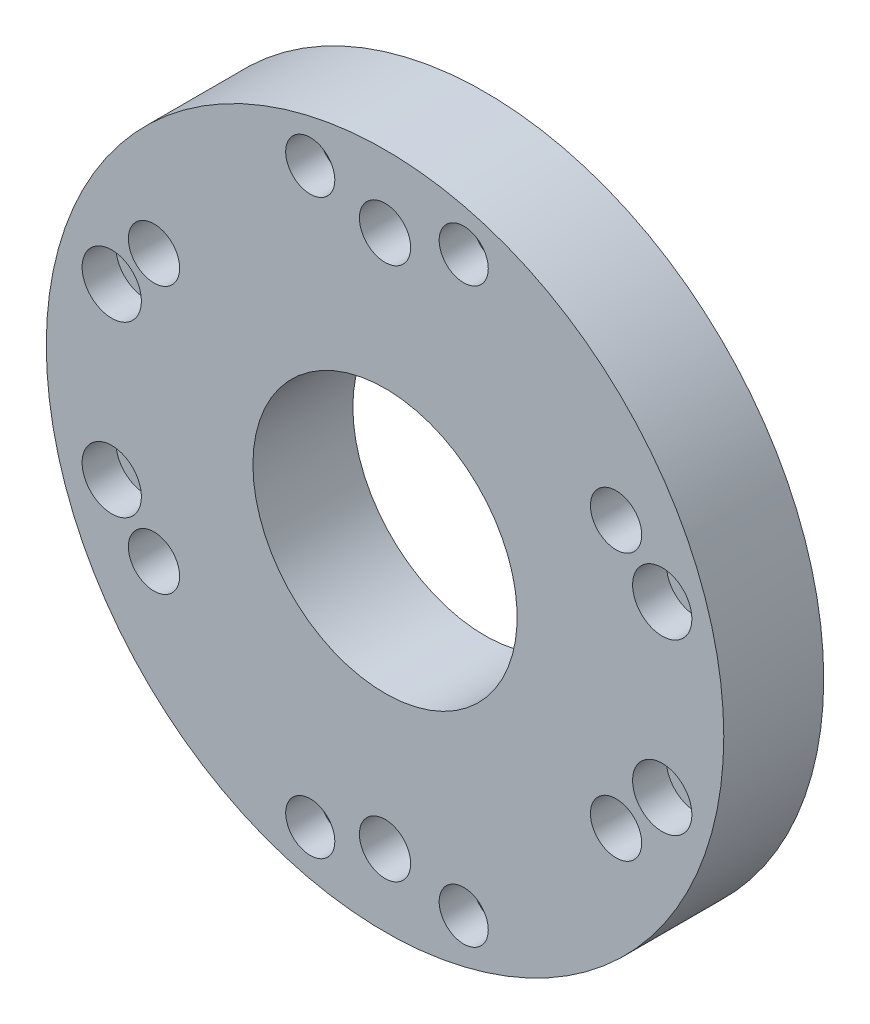
ISO-10303-21;
HEADER;
FILE_DESCRIPTION(('STEP AP214'),'2;1');
FILE_NAME('part.step','',(''),(''),'','','');
FILE_SCHEMA(('AUTOMOTIVE_DESIGN { 1 0 10303 214 1 1 1 1 }'));
ENDSEC;
DATA;
#1=APPLICATION_CONTEXT('core data for automotive mechanical design processes');
#2=APPLICATION_PROTOCOL_DEFINITION('international standard','automotive_design',2000,#1);
#3=PRODUCT_CONTEXT('',#1,'mechanical');
#4=PRODUCT('Part','Part','',(#3));
#5=PRODUCT_RELATED_PRODUCT_CATEGORY('part','',(#4));
#6=PRODUCT_DEFINITION_FORMATION('','',#4);
#7=PRODUCT_DEFINITION_CONTEXT('part definition',#1,'design');
#8=PRODUCT_DEFINITION('design','',#6,#7);
#9=PRODUCT_DEFINITION_SHAPE('','',#8);
#10=(LENGTH_UNIT() NAMED_UNIT(*) SI_UNIT(.MILLI.,.METRE.));
#11=(NAMED_UNIT(*) PLANE_ANGLE_UNIT() SI_UNIT($,.RADIAN.));
#12=(NAMED_UNIT(*) SI_UNIT($,.STERADIAN.) SOLID_ANGLE_UNIT());
#13=UNCERTAINTY_MEASURE_WITH_UNIT(LENGTH_MEASURE(1.E-05),#10,'distance_accuracy_value','');
#14=(GEOMETRIC_REPRESENTATION_CONTEXT(3) GLOBAL_UNCERTAINTY_ASSIGNED_CONTEXT((#13)) GLOBAL_UNIT_ASSIGNED_CONTEXT((#10,
#11,#12)) REPRESENTATION_CONTEXT('',''));
#15=CARTESIAN_POINT('',(0.,0.,0.));
#16=DIRECTION('',(0.,0.,1.));
#17=DIRECTION('',(1.,0.,0.));
#18=AXIS2_PLACEMENT_3D('',#15,#16,#17);
#19=CARTESIAN_POINT('',(32.7306438468949,10.1245664997554,11.8));
#20=DIRECTION('',(0.,0.,-1.));
#21=DIRECTION('',(-1.,0.,0.));
#22=AXIS2_PLACEMENT_3D('',#19,#20,#21);
#23=CYLINDRICAL_SURFACE('',#22,2.15);
#24=CARTESIAN_POINT('',(32.7306438468949,10.1245664997554,0.));
#25=DIRECTION('',(0.,0.,-1.));
#26=DIRECTION('',(-1.,0.,0.));
#27=AXIS2_PLACEMENT_3D('',#24,#25,#26);
#28=CIRCLE('',#27,2.15);
#29=CARTESIAN_POINT('',(30.5806438468949,10.1245664997554,0.));
#30=VERTEX_POINT('',#29);
#31=EDGE_CURVE('E50',#30,#30,#28,.T.);
#32=ORIENTED_EDGE('',*,*,#31,.T.);
#33=EDGE_LOOP('',(#32));
#34=FACE_BOUND('',#33,.T.);
#35=CARTESIAN_POINT('',(32.7306438468949,10.1245664997554,7.8));
#36=DIRECTION('',(0.,0.,1.));
#37=DIRECTION('',(1.,0.,0.));
#38=AXIS2_PLACEMENT_3D('',#35,#36,#37);
#39=CIRCLE('',#38,2.15);
#40=CARTESIAN_POINT('',(34.8806438468949,10.1245664997554,7.8));
#41=VERTEX_POINT('',#40);
#42=EDGE_CURVE('E41',#41,#41,#39,.F.);
#43=ORIENTED_EDGE('',*,*,#42,.F.);
#44=EDGE_LOOP('',(#43));
#45=FACE_BOUND('',#44,.T.);
#46=ADVANCED_FACE('F37',(#34,#45),#23,.F.);
#47=CARTESIAN_POINT('',(9.29064384689489,-33.6854335002446,11.8));
#48=DIRECTION('',(0.,0.,-1.));
#49=DIRECTION('',(-1.,0.,0.));
#50=AXIS2_PLACEMENT_3D('',#47,#48,#49);
#51=CYLINDRICAL_SURFACE('',#50,1.75);
#52=CARTESIAN_POINT('',(9.29064384689489,-33.6854335002446,0.));
#53=DIRECTION('',(0.,0.,-1.));
#54=DIRECTION('',(1.,0.,0.));
#55=AXIS2_PLACEMENT_3D('',#52,#53,#54);
#56=CIRCLE('',#55,1.75);
#57=CARTESIAN_POINT('',(11.0406438468949,-33.6854335002446,0.));
#58=VERTEX_POINT('',#57);
#59=EDGE_CURVE('E98',#58,#58,#56,.T.);
#60=ORIENTED_EDGE('',*,*,#59,.T.);
#61=EDGE_LOOP('',(#60));
#62=FACE_BOUND('',#61,.T.);
#63=CARTESIAN_POINT('',(9.29064384689489,-33.6854335002446,7.8));
#64=DIRECTION('',(0.,0.,1.));
#65=DIRECTION('',(1.,0.,0.));
#66=AXIS2_PLACEMENT_3D('',#63,#64,#65);
#67=CIRCLE('',#66,1.75);
#68=CARTESIAN_POINT('',(11.0406438468949,-33.6854335002446,7.8));
#69=VERTEX_POINT('',#68);
#70=EDGE_CURVE('E73',#69,#69,#67,.F.);
#71=ORIENTED_EDGE('',*,*,#70,.F.);
#72=EDGE_LOOP('',(#71));
#73=FACE_BOUND('',#72,.T.);
#74=ADVANCED_FACE('F146',(#62,#73),#51,.F.);
#75=CARTESIAN_POINT('',(-8.82935615310511,-33.6854335002446,11.8));
#76=DIRECTION('',(0.,0.,-1.));
#77=DIRECTION('',(-1.,0.,0.));
#78=AXIS2_PLACEMENT_3D('',#75,#76,#77);
#79=CYLINDRICAL_SURFACE('',#78,1.75);
#80=CARTESIAN_POINT('',(-8.82935615310511,-33.6854335002446,0.));
#81=DIRECTION('',(0.,0.,-1.));
#82=DIRECTION('',(-1.,0.,0.));
#83=AXIS2_PLACEMENT_3D('',#80,#81,#82);
#84=CIRCLE('',#83,1.75);
#85=CARTESIAN_POINT('',(-10.5793561531051,-33.6854335002446,0.));
#86=VERTEX_POINT('',#85);
#87=EDGE_CURVE('E95',#86,#86,#84,.T.);
#88=ORIENTED_EDGE('',*,*,#87,.T.);
#89=EDGE_LOOP('',(#88));
#90=FACE_BOUND('',#89,.T.);
#91=CARTESIAN_POINT('',(-8.82935615310511,-33.6854335002446,7.8));
#92=DIRECTION('',(0.,0.,1.));
#93=DIRECTION('',(1.,0.,0.));
#94=AXIS2_PLACEMENT_3D('',#91,#92,#93);
#95=CIRCLE('',#94,1.75);
#96=CARTESIAN_POINT('',(-7.07935615310511,-33.6854335002446,7.8));
#97=VERTEX_POINT('',#96);
#98=EDGE_CURVE('E71',#97,#97,#95,.F.);
#99=ORIENTED_EDGE('',*,*,#98,.F.);
#100=EDGE_LOOP('',(#99));
#101=FACE_BOUND('',#100,.T.);
#102=ADVANCED_FACE('F153',(#90,#101),#79,.F.);
#103=CARTESIAN_POINT('',(-8.82935615310511,33.9345664997554,11.8));
#104=DIRECTION('',(0.,0.,-1.));
#105=DIRECTION('',(-1.,0.,0.));
#106=AXIS2_PLACEMENT_3D('',#103,#104,#105);
#107=CYLINDRICAL_SURFACE('',#106,1.75);
#108=CARTESIAN_POINT('',(-8.82935615310511,33.9345664997554,0.));
#109=DIRECTION('',(0.,0.,-1.));
#110=DIRECTION('',(1.,0.,0.));
#111=AXIS2_PLACEMENT_3D('',#108,#109,#110);
#112=CIRCLE('',#111,1.75);
#113=CARTESIAN_POINT('',(-7.07935615310511,33.9345664997554,0.));
#114=VERTEX_POINT('',#113);
#115=EDGE_CURVE('E91',#114,#114,#112,.T.);
#116=ORIENTED_EDGE('',*,*,#115,.T.);
#117=EDGE_LOOP('',(#116));
#118=FACE_BOUND('',#117,.T.);
#119=CARTESIAN_POINT('',(-8.82935615310511,33.9345664997554,7.8));
#120=DIRECTION('',(0.,0.,1.));
#121=DIRECTION('',(1.,0.,0.));
#122=AXIS2_PLACEMENT_3D('',#119,#120,#121);
#123=CIRCLE('',#122,1.75);
#124=CARTESIAN_POINT('',(-7.07935615310511,33.9345664997554,7.8));
#125=VERTEX_POINT('',#124);
#126=EDGE_CURVE('E68',#125,#125,#123,.F.);
#127=ORIENTED_EDGE('',*,*,#126,.F.);
#128=EDGE_LOOP('',(#127));
#129=FACE_BOUND('',#128,.T.);
#130=ADVANCED_FACE('F161',(#118,#129),#107,.F.);
#131=CARTESIAN_POINT('',(9.29064384689489,33.9345664997554,11.8));
#132=DIRECTION('',(0.,0.,-1.));
#133=DIRECTION('',(-1.,0.,0.));
#134=AXIS2_PLACEMENT_3D('',#131,#132,#133);
#135=CYLINDRICAL_SURFACE('',#134,1.75);
#136=CARTESIAN_POINT('',(9.29064384689489,33.9345664997554,0.));
#137=DIRECTION('',(0.,0.,-1.));
#138=DIRECTION('',(-1.,0.,0.));
#139=AXIS2_PLACEMENT_3D('',#136,#137,#138);
#140=CIRCLE('',#139,1.75);
#141=CARTESIAN_POINT('',(7.54064384689489,33.9345664997554,0.));
#142=VERTEX_POINT('',#141);
#143=EDGE_CURVE('E94',#142,#142,#140,.T.);
#144=ORIENTED_EDGE('',*,*,#143,.T.);
#145=EDGE_LOOP('',(#144));
#146=FACE_BOUND('',#145,.T.);
#147=CARTESIAN_POINT('',(9.29064384689489,33.9345664997554,7.8));
#148=DIRECTION('',(0.,0.,1.));
#149=DIRECTION('',(1.,0.,0.));
#150=AXIS2_PLACEMENT_3D('',#147,#148,#149);
#151=CIRCLE('',#150,1.75);
#152=CARTESIAN_POINT('',(11.0406438468949,33.9345664997554,7.8));
#153=VERTEX_POINT('',#152);
#154=EDGE_CURVE('E65',#153,#153,#151,.F.);
#155=ORIENTED_EDGE('',*,*,#154,.F.);
#156=EDGE_LOOP('',(#155));
#157=FACE_BOUND('',#156,.T.);
#158=ADVANCED_FACE('F113',(#146,#157),#135,.F.);
#159=CARTESIAN_POINT('',(-32.2693561531051,10.1245664997554,11.8));
#160=DIRECTION('',(0.,0.,-1.));
#161=DIRECTION('',(-1.,0.,0.));
#162=AXIS2_PLACEMENT_3D('',#159,#160,#161);
#163=CYLINDRICAL_SURFACE('',#162,2.15);
#164=CARTESIAN_POINT('',(-32.2693561531051,10.1245664997554,0.));
#165=DIRECTION('',(0.,0.,-1.));
#166=DIRECTION('',(1.,0.,0.));
#167=AXIS2_PLACEMENT_3D('',#164,#165,#166);
#168=CIRCLE('',#167,2.15);
#169=CARTESIAN_POINT('',(-30.1193561531051,10.1245664997554,0.));
#170=VERTEX_POINT('',#169);
#171=EDGE_CURVE('E108',#170,#170,#168,.T.);
#172=ORIENTED_EDGE('',*,*,#171,.T.);
#173=EDGE_LOOP('',(#172));
#174=FACE_BOUND('',#173,.T.);
#175=CARTESIAN_POINT('',(-32.2693561531051,10.1245664997554,7.8));
#176=DIRECTION('',(0.,0.,1.));
#177=DIRECTION('',(1.,0.,0.));
#178=AXIS2_PLACEMENT_3D('',#175,#176,#177);
#179=CIRCLE('',#178,2.15);
#180=CARTESIAN_POINT('',(-30.1193561531051,10.1245664997554,7.8));
#181=VERTEX_POINT('',#180);
#182=EDGE_CURVE('E62',#181,#181,#179,.F.);
#183=ORIENTED_EDGE('',*,*,#182,.F.);
#184=EDGE_LOOP('',(#183));
#185=FACE_BOUND('',#184,.T.);
#186=ADVANCED_FACE('F160',(#174,#185),#163,.F.);
#187=CARTESIAN_POINT('',(-32.2693561531051,-9.87543350024464,11.8));
#188=DIRECTION('',(0.,0.,-1.));
#189=DIRECTION('',(-1.,0.,0.));
#190=AXIS2_PLACEMENT_3D('',#187,#188,#189);
#191=CYLINDRICAL_SURFACE('',#190,2.15);
#192=CARTESIAN_POINT('',(-32.2693561531051,-9.87543350024464,0.));
#193=DIRECTION('',(0.,0.,-1.));
#194=DIRECTION('',(-1.,0.,0.));
#195=AXIS2_PLACEMENT_3D('',#192,#193,#194);
#196=CIRCLE('',#195,2.15);
#197=CARTESIAN_POINT('',(-34.4193561531051,-9.87543350024464,0.));
#198=VERTEX_POINT('',#197);
#199=EDGE_CURVE('E105',#198,#198,#196,.T.);
#200=ORIENTED_EDGE('',*,*,#199,.T.);
#201=EDGE_LOOP('',(#200));
#202=FACE_BOUND('',#201,.T.);
#203=CARTESIAN_POINT('',(-32.2693561531051,-9.87543350024464,7.8));
#204=DIRECTION('',(0.,0.,1.));
#205=DIRECTION('',(1.,0.,0.));
#206=AXIS2_PLACEMENT_3D('',#203,#204,#205);
#207=CIRCLE('',#206,2.15);
#208=CARTESIAN_POINT('',(-30.1193561531051,-9.87543350024464,7.8));
#209=VERTEX_POINT('',#208);
#210=EDGE_CURVE('E58',#209,#209,#207,.F.);
#211=ORIENTED_EDGE('',*,*,#210,.F.);
#212=EDGE_LOOP('',(#211));
#213=FACE_BOUND('',#212,.T.);
#214=ADVANCED_FACE('F142',(#202,#213),#191,.F.);
#215=CARTESIAN_POINT('',(32.7306438468949,-9.87543350024464,11.8));
#216=DIRECTION('',(0.,0.,-1.));
#217=DIRECTION('',(-1.,0.,0.));
#218=AXIS2_PLACEMENT_3D('',#215,#216,#217);
#219=CYLINDRICAL_SURFACE('',#218,2.15);
#220=CARTESIAN_POINT('',(32.7306438468949,-9.87543350024464,0.));
#221=DIRECTION('',(0.,0.,-1.));
#222=DIRECTION('',(1.,0.,0.));
#223=AXIS2_PLACEMENT_3D('',#220,#221,#222);
#224=CIRCLE('',#223,2.15);
#225=CARTESIAN_POINT('',(34.8806438468949,-9.87543350024464,0.));
#226=VERTEX_POINT('',#225);
#227=EDGE_CURVE('E102',#226,#226,#224,.T.);
#228=ORIENTED_EDGE('',*,*,#227,.T.);
#229=EDGE_LOOP('',(#228));
#230=FACE_BOUND('',#229,.T.);
#231=CARTESIAN_POINT('',(32.7306438468949,-9.87543350024464,7.8));
#232=DIRECTION('',(0.,0.,1.));
#233=DIRECTION('',(1.,0.,0.));
#234=AXIS2_PLACEMENT_3D('',#231,#232,#233);
#235=CIRCLE('',#234,2.15);
#236=CARTESIAN_POINT('',(34.8806438468949,-9.87543350024464,7.8));
#237=VERTEX_POINT('',#236);
#238=EDGE_CURVE('E55',#237,#237,#235,.F.);
#239=ORIENTED_EDGE('',*,*,#238,.F.);
#240=EDGE_LOOP('',(#239));
#241=FACE_BOUND('',#240,.T.);
#242=ADVANCED_FACE('F134',(#230,#241),#219,.F.);
#243=CARTESIAN_POINT('',(0.,0.,11.8));
#244=DIRECTION('',(0.,0.,-1.));
#245=DIRECTION('',(-1.,0.,0.));
#246=AXIS2_PLACEMENT_3D('',#243,#244,#245);
#247=CYLINDRICAL_SURFACE('',#246,40.);
#248=CARTESIAN_POINT('',(0.,0.,11.8));
#249=DIRECTION('',(0.,0.,1.));
#250=DIRECTION('',(1.,0.,0.));
#251=AXIS2_PLACEMENT_3D('',#248,#249,#250);
#252=CIRCLE('',#251,40.);
#253=CARTESIAN_POINT('',(40.,0.,11.8));
#254=VERTEX_POINT('',#253);
#255=EDGE_CURVE('E10',#254,#254,#252,.T.);
#256=ORIENTED_EDGE('',*,*,#255,.F.);
#257=EDGE_LOOP('',(#256));
#258=FACE_BOUND('',#257,.T.);
#259=CARTESIAN_POINT('',(0.,0.,0.));
#260=DIRECTION('',(0.,0.,1.));
#261=DIRECTION('',(1.,0.,0.));
#262=AXIS2_PLACEMENT_3D('',#259,#260,#261);
#263=CIRCLE('',#262,40.);
#264=CARTESIAN_POINT('',(40.,0.,0.));
#265=VERTEX_POINT('',#264);
#266=EDGE_CURVE('E45',#265,#265,#263,.T.);
#267=ORIENTED_EDGE('',*,*,#266,.T.);
#268=EDGE_LOOP('',(#267));
#269=FACE_BOUND('',#268,.T.);
#270=ADVANCED_FACE('F39',(#258,#269),#247,.T.);
#271=CARTESIAN_POINT('',(0.,0.,11.8));
#272=DIRECTION('',(0.,0.,1.));
#273=DIRECTION('',(1.,0.,0.));
#274=AXIS2_PLACEMENT_3D('',#271,#272,#273);
#275=PLANE('',#274);
#276=CARTESIAN_POINT('',(32.7306438468949,10.1245664997554,11.8));
#277=DIRECTION('',(0.,0.,1.));
#278=DIRECTION('',(1.,0.,0.));
#279=AXIS2_PLACEMENT_3D('',#276,#277,#278);
#280=CIRCLE('',#279,3.5);
#281=CARTESIAN_POINT('',(36.2306438468949,10.1245664997554,11.8));
#282=VERTEX_POINT('',#281);
#283=EDGE_CURVE('E276',#282,#282,#280,.T.);
#284=ORIENTED_EDGE('',*,*,#283,.F.);
#285=EDGE_LOOP('',(#284));
#286=FACE_BOUND('',#285,.T.);
#287=CARTESIAN_POINT('',(-32.2693561531051,-9.87543350024464,11.8));
#288=DIRECTION('',(0.,0.,1.));
#289=DIRECTION('',(1.,0.,0.));
#290=AXIS2_PLACEMENT_3D('',#287,#288,#289);
#291=CIRCLE('',#290,3.5);
#292=CARTESIAN_POINT('',(-28.7693561531051,-9.87543350024464,11.8));
#293=VERTEX_POINT('',#292);
#294=EDGE_CURVE('E292',#293,#293,#291,.T.);
#295=ORIENTED_EDGE('',*,*,#294,.F.);
#296=EDGE_LOOP('',(#295));
#297=FACE_BOUND('',#296,.T.);
#298=CARTESIAN_POINT('',(-8.82935615310511,-33.6854335002446,11.8));
#299=DIRECTION('',(0.,0.,1.));
#300=DIRECTION('',(1.,0.,0.));
#301=AXIS2_PLACEMENT_3D('',#298,#299,#300);
#302=CIRCLE('',#301,2.9);
#303=CARTESIAN_POINT('',(-5.92935615310511,-33.6854335002446,11.8));
#304=VERTEX_POINT('',#303);
#305=EDGE_CURVE('E308',#304,#304,#302,.T.);
#306=ORIENTED_EDGE('',*,*,#305,.F.);
#307=EDGE_LOOP('',(#306));
#308=FACE_BOUND('',#307,.T.);
#309=CARTESIAN_POINT('',(-8.82935615310511,33.9345664997554,11.8));
#310=DIRECTION('',(0.,0.,1.));
#311=DIRECTION('',(1.,0.,0.));
#312=AXIS2_PLACEMENT_3D('',#309,#310,#311);
#313=CIRCLE('',#312,2.9);
#314=CARTESIAN_POINT('',(-5.92935615310511,33.9345664997554,11.8));
#315=VERTEX_POINT('',#314);
#316=EDGE_CURVE('E301',#315,#315,#313,.T.);
#317=ORIENTED_EDGE('',*,*,#316,.F.);
#318=EDGE_LOOP('',(#317));
#319=FACE_BOUND('',#318,.T.);
#320=CARTESIAN_POINT('',(9.29064384689489,33.9345664997554,11.8));
#321=DIRECTION('',(0.,0.,1.));
#322=DIRECTION('',(1.,0.,0.));
#323=AXIS2_PLACEMENT_3D('',#320,#321,#322);
#324=CIRCLE('',#323,2.9);
#325=CARTESIAN_POINT('',(12.1906438468949,33.9345664997554,11.8));
#326=VERTEX_POINT('',#325);
#327=EDGE_CURVE('E271',#326,#326,#324,.T.);
#328=ORIENTED_EDGE('',*,*,#327,.F.);
#329=EDGE_LOOP('',(#328));
#330=FACE_BOUND('',#329,.T.);
#331=CARTESIAN_POINT('',(32.7306438468949,-9.87543350024464,11.8));
#332=DIRECTION('',(0.,0.,1.));
#333=DIRECTION('',(1.,0.,0.));
#334=AXIS2_PLACEMENT_3D('',#331,#332,#333);
#335=CIRCLE('',#334,3.5);
#336=CARTESIAN_POINT('',(36.2306438468949,-9.87543350024464,11.8));
#337=VERTEX_POINT('',#336);
#338=EDGE_CURVE('E278',#337,#337,#335,.T.);
#339=ORIENTED_EDGE('',*,*,#338,.F.);
#340=EDGE_LOOP('',(#339));
#341=FACE_BOUND('',#340,.T.);
#342=CARTESIAN_POINT('',(9.29064384689489,-33.6854335002446,11.8));
#343=DIRECTION('',(0.,0.,1.));
#344=DIRECTION('',(1.,0.,0.));
#345=AXIS2_PLACEMENT_3D('',#342,#343,#344);
#346=CIRCLE('',#345,2.9);
#347=CARTESIAN_POINT('',(12.1906438468949,-33.6854335002446,11.8));
#348=VERTEX_POINT('',#347);
#349=EDGE_CURVE('E286',#348,#348,#346,.T.);
#350=ORIENTED_EDGE('',*,*,#349,.F.);
#351=EDGE_LOOP('',(#350));
#352=FACE_BOUND('',#351,.T.);
#353=CARTESIAN_POINT('',(-32.2693561531051,10.1245664997554,11.8));
#354=DIRECTION('',(0.,0.,1.));
#355=DIRECTION('',(1.,0.,0.));
#356=AXIS2_PLACEMENT_3D('',#353,#354,#355);
#357=CIRCLE('',#356,3.5);
#358=CARTESIAN_POINT('',(-28.7693561531051,10.1245664997554,11.8));
#359=VERTEX_POINT('',#358);
#360=EDGE_CURVE('E304',#359,#359,#357,.T.);
#361=ORIENTED_EDGE('',*,*,#360,.F.);
#362=EDGE_LOOP('',(#361));
#363=FACE_BOUND('',#362,.T.);
#364=CARTESIAN_POINT('',(0.,31.5,11.8));
#365=DIRECTION('',(0.,0.,-1.));
#366=DIRECTION('',(-1.,0.,0.));
#367=AXIS2_PLACEMENT_3D('',#364,#365,#366);
#368=CIRCLE('',#367,3.025);
#369=CARTESIAN_POINT('',(-3.025,31.5,11.8));
#370=VERTEX_POINT('',#369);
#371=EDGE_CURVE('E101',#370,#370,#368,.T.);
#372=ORIENTED_EDGE('',*,*,#371,.T.);
#373=EDGE_LOOP('',(#372));
#374=FACE_BOUND('',#373,.T.);
#375=CARTESIAN_POINT('',(2.19963324347117E-13,-31.5,11.8));
#376=DIRECTION('',(0.,0.,-1.));
#377=DIRECTION('',(-1.,0.,0.));
#378=AXIS2_PLACEMENT_3D('',#375,#376,#377);
#379=CIRCLE('',#378,3.025);
#380=CARTESIAN_POINT('',(-3.02499999999978,-31.5,11.8));
#381=VERTEX_POINT('',#380);
#382=EDGE_CURVE('E333',#381,#381,#379,.T.);
#383=ORIENTED_EDGE('',*,*,#382,.T.);
#384=EDGE_LOOP('',(#383));
#385=FACE_BOUND('',#384,.T.);
#386=CARTESIAN_POINT('',(-27.2798002192098,-15.7500000000001,11.8));
#387=DIRECTION('',(0.,0.,-1.));
#388=DIRECTION('',(-1.,0.,0.));
#389=AXIS2_PLACEMENT_3D('',#386,#387,#388);
#390=CIRCLE('',#389,3.025);
#391=CARTESIAN_POINT('',(-30.3048002192098,-15.7500000000001,11.8));
#392=VERTEX_POINT('',#391);
#393=EDGE_CURVE('E327',#392,#392,#390,.T.);
#394=ORIENTED_EDGE('',*,*,#393,.T.);
#395=EDGE_LOOP('',(#394));
#396=FACE_BOUND('',#395,.T.);
#397=CARTESIAN_POINT('',(-27.2798002192099,15.7499999999999,11.8));
#398=DIRECTION('',(0.,0.,-1.));
#399=DIRECTION('',(-1.,0.,0.));
#400=AXIS2_PLACEMENT_3D('',#397,#398,#399);
#401=CIRCLE('',#400,3.025);
#402=CARTESIAN_POINT('',(-30.3048002192099,15.7499999999999,11.8));
#403=VERTEX_POINT('',#402);
#404=EDGE_CURVE('E326',#403,#403,#401,.T.);
#405=ORIENTED_EDGE('',*,*,#404,.T.);
#406=EDGE_LOOP('',(#405));
#407=FACE_BOUND('',#406,.T.);
#408=CARTESIAN_POINT('',(0.,0.,11.8));
#409=DIRECTION('',(0.,0.,-1.));
#410=DIRECTION('',(-1.,0.,0.));
#411=AXIS2_PLACEMENT_3D('',#408,#409,#410);
#412=CIRCLE('',#411,15.6);
#413=CARTESIAN_POINT('',(-15.6,0.,11.8));
#414=VERTEX_POINT('',#413);
#415=EDGE_CURVE('E339',#414,#414,#412,.T.);
#416=ORIENTED_EDGE('',*,*,#415,.T.);
#417=EDGE_LOOP('',(#416));
#418=FACE_BOUND('',#417,.T.);
#419=CARTESIAN_POINT('',(27.27980021921,-15.7499999999997,11.8));
#420=DIRECTION('',(0.,0.,-1.));
#421=DIRECTION('',(-1.,0.,0.));
#422=AXIS2_PLACEMENT_3D('',#419,#420,#421);
#423=CIRCLE('',#422,3.025);
#424=CARTESIAN_POINT('',(24.25480021921,-15.7499999999997,11.8));
#425=VERTEX_POINT('',#424);
#426=EDGE_CURVE('E87',#425,#425,#423,.T.);
#427=ORIENTED_EDGE('',*,*,#426,.T.);
#428=EDGE_LOOP('',(#427));
#429=FACE_BOUND('',#428,.T.);
#430=CARTESIAN_POINT('',(27.2798002192096,15.7500000000003,11.8));
#431=DIRECTION('',(0.,0.,-1.));
#432=DIRECTION('',(-1.,0.,0.));
#433=AXIS2_PLACEMENT_3D('',#430,#431,#432);
#434=CIRCLE('',#433,3.025);
#435=CARTESIAN_POINT('',(24.2548002192096,15.7500000000003,11.8));
#436=VERTEX_POINT('',#435);
#437=EDGE_CURVE('E78',#436,#436,#434,.T.);
#438=ORIENTED_EDGE('',*,*,#437,.T.);
#439=EDGE_LOOP('',(#438));
#440=FACE_BOUND('',#439,.T.);
#441=ORIENTED_EDGE('',*,*,#255,.T.);
#442=EDGE_LOOP('',(#441));
#443=FACE_BOUND('',#442,.T.);
#444=ADVANCED_FACE('F120',(#286,#297,#308,#319,#330,#341,#352,#363,#374,#385,#396,#407,#418,
#429,#440,#443),#275,.T.);
#445=CARTESIAN_POINT('',(0.,0.,0.));
#446=DIRECTION('',(0.,0.,1.));
#447=DIRECTION('',(1.,0.,0.));
#448=AXIS2_PLACEMENT_3D('',#445,#446,#447);
#449=PLANE('',#448);
#450=CARTESIAN_POINT('',(0.,31.5,0.));
#451=DIRECTION('',(0.,0.,-1.));
#452=DIRECTION('',(-1.,0.,0.));
#453=AXIS2_PLACEMENT_3D('',#450,#451,#452);
#454=CIRCLE('',#453,3.025);
#455=CARTESIAN_POINT('',(-3.025,31.5,0.));
#456=VERTEX_POINT('',#455);
#457=EDGE_CURVE('E319',#456,#456,#454,.T.);
#458=ORIENTED_EDGE('',*,*,#457,.F.);
#459=EDGE_LOOP('',(#458));
#460=FACE_BOUND('',#459,.T.);
#461=CARTESIAN_POINT('',(2.19963324347117E-13,-31.5,0.));
#462=DIRECTION('',(0.,0.,-1.));
#463=DIRECTION('',(-1.,0.,0.));
#464=AXIS2_PLACEMENT_3D('',#461,#462,#463);
#465=CIRCLE('',#464,3.025);
#466=CARTESIAN_POINT('',(-3.02499999999978,-31.5,0.));
#467=VERTEX_POINT('',#466);
#468=EDGE_CURVE('E330',#467,#467,#465,.T.);
#469=ORIENTED_EDGE('',*,*,#468,.F.);
#470=EDGE_LOOP('',(#469));
#471=FACE_BOUND('',#470,.T.);
#472=CARTESIAN_POINT('',(-27.2798002192098,-15.7500000000001,0.));
#473=DIRECTION('',(0.,0.,-1.));
#474=DIRECTION('',(-1.,0.,0.));
#475=AXIS2_PLACEMENT_3D('',#472,#473,#474);
#476=CIRCLE('',#475,3.025);
#477=CARTESIAN_POINT('',(-30.3048002192098,-15.7500000000001,0.));
#478=VERTEX_POINT('',#477);
#479=EDGE_CURVE('E323',#478,#478,#476,.T.);
#480=ORIENTED_EDGE('',*,*,#479,.F.);
#481=EDGE_LOOP('',(#480));
#482=FACE_BOUND('',#481,.T.);
#483=CARTESIAN_POINT('',(-27.2798002192099,15.7499999999999,0.));
#484=DIRECTION('',(0.,0.,-1.));
#485=DIRECTION('',(-1.,0.,0.));
#486=AXIS2_PLACEMENT_3D('',#483,#484,#485);
#487=CIRCLE('',#486,3.025);
#488=CARTESIAN_POINT('',(-30.3048002192099,15.7499999999999,0.));
#489=VERTEX_POINT('',#488);
#490=EDGE_CURVE('E342',#489,#489,#487,.T.);
#491=ORIENTED_EDGE('',*,*,#490,.F.);
#492=EDGE_LOOP('',(#491));
#493=FACE_BOUND('',#492,.T.);
#494=CARTESIAN_POINT('',(0.,0.,0.));
#495=DIRECTION('',(0.,0.,-1.));
#496=DIRECTION('',(-1.,0.,0.));
#497=AXIS2_PLACEMENT_3D('',#494,#495,#496);
#498=CIRCLE('',#497,15.6);
#499=CARTESIAN_POINT('',(-15.6,0.,0.));
#500=VERTEX_POINT('',#499);
#501=EDGE_CURVE('E322',#500,#500,#498,.T.);
#502=ORIENTED_EDGE('',*,*,#501,.F.);
#503=EDGE_LOOP('',(#502));
#504=FACE_BOUND('',#503,.T.);
#505=CARTESIAN_POINT('',(27.27980021921,-15.7499999999997,0.));
#506=DIRECTION('',(0.,0.,-1.));
#507=DIRECTION('',(-1.,0.,0.));
#508=AXIS2_PLACEMENT_3D('',#505,#506,#507);
#509=CIRCLE('',#508,3.025);
#510=CARTESIAN_POINT('',(24.25480021921,-15.7499999999997,0.));
#511=VERTEX_POINT('',#510);
#512=EDGE_CURVE('E336',#511,#511,#509,.T.);
#513=ORIENTED_EDGE('',*,*,#512,.F.);
#514=EDGE_LOOP('',(#513));
#515=FACE_BOUND('',#514,.T.);
#516=CARTESIAN_POINT('',(27.2798002192096,15.7500000000003,0.));
#517=DIRECTION('',(0.,0.,-1.));
#518=DIRECTION('',(-1.,0.,0.));
#519=AXIS2_PLACEMENT_3D('',#516,#517,#518);
#520=CIRCLE('',#519,3.025);
#521=CARTESIAN_POINT('',(24.2548002192096,15.7500000000003,0.));
#522=VERTEX_POINT('',#521);
#523=EDGE_CURVE('E82',#522,#522,#520,.T.);
#524=ORIENTED_EDGE('',*,*,#523,.F.);
#525=EDGE_LOOP('',(#524));
#526=FACE_BOUND('',#525,.T.);
#527=ORIENTED_EDGE('',*,*,#227,.F.);
#528=EDGE_LOOP('',(#527));
#529=FACE_BOUND('',#528,.T.);
#530=ORIENTED_EDGE('',*,*,#199,.F.);
#531=EDGE_LOOP('',(#530));
#532=FACE_BOUND('',#531,.T.);
#533=ORIENTED_EDGE('',*,*,#171,.F.);
#534=EDGE_LOOP('',(#533));
#535=FACE_BOUND('',#534,.T.);
#536=ORIENTED_EDGE('',*,*,#143,.F.);
#537=EDGE_LOOP('',(#536));
#538=FACE_BOUND('',#537,.T.);
#539=ORIENTED_EDGE('',*,*,#115,.F.);
#540=EDGE_LOOP('',(#539));
#541=FACE_BOUND('',#540,.T.);
#542=ORIENTED_EDGE('',*,*,#87,.F.);
#543=EDGE_LOOP('',(#542));
#544=FACE_BOUND('',#543,.T.);
#545=ORIENTED_EDGE('',*,*,#59,.F.);
#546=EDGE_LOOP('',(#545));
#547=FACE_BOUND('',#546,.T.);
#548=ORIENTED_EDGE('',*,*,#31,.F.);
#549=EDGE_LOOP('',(#548));
#550=FACE_BOUND('',#549,.T.);
#551=ORIENTED_EDGE('',*,*,#266,.F.);
#552=EDGE_LOOP('',(#551));
#553=FACE_BOUND('',#552,.T.);
#554=ADVANCED_FACE('F116',(#460,#471,#482,#493,#504,#515,#526,#529,#532,#535,#538,#541,#544,
#547,#550,#553),#449,.F.);
#555=CARTESIAN_POINT('',(27.2798002192096,15.7500000000003,11.8));
#556=DIRECTION('',(0.,0.,-1.));
#557=DIRECTION('',(-1.,0.,0.));
#558=AXIS2_PLACEMENT_3D('',#555,#556,#557);
#559=CYLINDRICAL_SURFACE('',#558,3.025);
#560=ORIENTED_EDGE('',*,*,#437,.F.);
#561=EDGE_LOOP('',(#560));
#562=FACE_BOUND('',#561,.T.);
#563=ORIENTED_EDGE('',*,*,#523,.T.);
#564=EDGE_LOOP('',(#563));
#565=FACE_BOUND('',#564,.T.);
#566=ADVANCED_FACE('F119',(#562,#565),#559,.F.);
#567=CARTESIAN_POINT('',(27.27980021921,-15.7499999999997,11.8));
#568=DIRECTION('',(0.,0.,-1.));
#569=DIRECTION('',(-1.,0.,0.));
#570=AXIS2_PLACEMENT_3D('',#567,#568,#569);
#571=CYLINDRICAL_SURFACE('',#570,3.025);
#572=ORIENTED_EDGE('',*,*,#426,.F.);
#573=EDGE_LOOP('',(#572));
#574=FACE_BOUND('',#573,.T.);
#575=ORIENTED_EDGE('',*,*,#512,.T.);
#576=EDGE_LOOP('',(#575));
#577=FACE_BOUND('',#576,.T.);
#578=ADVANCED_FACE('F176',(#574,#577),#571,.F.);
#579=CARTESIAN_POINT('',(0.,0.,11.8));
#580=DIRECTION('',(0.,0.,-1.));
#581=DIRECTION('',(-1.,0.,0.));
#582=AXIS2_PLACEMENT_3D('',#579,#580,#581);
#583=CYLINDRICAL_SURFACE('',#582,15.6);
#584=ORIENTED_EDGE('',*,*,#415,.F.);
#585=EDGE_LOOP('',(#584));
#586=FACE_BOUND('',#585,.T.);
#587=ORIENTED_EDGE('',*,*,#501,.T.);
#588=EDGE_LOOP('',(#587));
#589=FACE_BOUND('',#588,.T.);
#590=ADVANCED_FACE('F180',(#586,#589),#583,.F.);
#591=CARTESIAN_POINT('',(-27.2798002192099,15.7499999999999,11.8));
#592=DIRECTION('',(0.,0.,-1.));
#593=DIRECTION('',(-1.,0.,0.));
#594=AXIS2_PLACEMENT_3D('',#591,#592,#593);
#595=CYLINDRICAL_SURFACE('',#594,3.025);
#596=ORIENTED_EDGE('',*,*,#404,.F.);
#597=EDGE_LOOP('',(#596));
#598=FACE_BOUND('',#597,.T.);
#599=ORIENTED_EDGE('',*,*,#490,.T.);
#600=EDGE_LOOP('',(#599));
#601=FACE_BOUND('',#600,.T.);
#602=ADVANCED_FACE('F182',(#598,#601),#595,.F.);
#603=CARTESIAN_POINT('',(-27.2798002192098,-15.7500000000001,11.8));
#604=DIRECTION('',(0.,0.,-1.));
#605=DIRECTION('',(-1.,0.,0.));
#606=AXIS2_PLACEMENT_3D('',#603,#604,#605);
#607=CYLINDRICAL_SURFACE('',#606,3.025);
#608=ORIENTED_EDGE('',*,*,#393,.F.);
#609=EDGE_LOOP('',(#608));
#610=FACE_BOUND('',#609,.T.);
#611=ORIENTED_EDGE('',*,*,#479,.T.);
#612=EDGE_LOOP('',(#611));
#613=FACE_BOUND('',#612,.T.);
#614=ADVANCED_FACE('F185',(#610,#613),#607,.F.);
#615=CARTESIAN_POINT('',(2.19963324347117E-13,-31.5,11.8));
#616=DIRECTION('',(0.,0.,-1.));
#617=DIRECTION('',(-1.,0.,0.));
#618=AXIS2_PLACEMENT_3D('',#615,#616,#617);
#619=CYLINDRICAL_SURFACE('',#618,3.025);
#620=ORIENTED_EDGE('',*,*,#382,.F.);
#621=EDGE_LOOP('',(#620));
#622=FACE_BOUND('',#621,.T.);
#623=ORIENTED_EDGE('',*,*,#468,.T.);
#624=EDGE_LOOP('',(#623));
#625=FACE_BOUND('',#624,.T.);
#626=ADVANCED_FACE('F190',(#622,#625),#619,.F.);
#627=CARTESIAN_POINT('',(0.,31.5,11.8));
#628=DIRECTION('',(0.,0.,-1.));
#629=DIRECTION('',(-1.,0.,0.));
#630=AXIS2_PLACEMENT_3D('',#627,#628,#629);
#631=CYLINDRICAL_SURFACE('',#630,3.025);
#632=ORIENTED_EDGE('',*,*,#371,.F.);
#633=EDGE_LOOP('',(#632));
#634=FACE_BOUND('',#633,.T.);
#635=ORIENTED_EDGE('',*,*,#457,.T.);
#636=EDGE_LOOP('',(#635));
#637=FACE_BOUND('',#636,.T.);
#638=ADVANCED_FACE('F193',(#634,#637),#631,.F.);
#639=CARTESIAN_POINT('',(32.7306438468949,-9.87543350024464,7.8));
#640=DIRECTION('',(0.,0.,1.));
#641=DIRECTION('',(1.,0.,0.));
#642=AXIS2_PLACEMENT_3D('',#639,#640,#641);
#643=PLANE('',#642);
#644=CARTESIAN_POINT('',(32.7306438468949,-9.87543350024464,7.8));
#645=DIRECTION('',(0.,0.,1.));
#646=DIRECTION('',(1.,0.,0.));
#647=AXIS2_PLACEMENT_3D('',#644,#645,#646);
#648=CIRCLE('',#647,3.5);
#649=CARTESIAN_POINT('',(36.2306438468949,-9.87543350024464,7.8));
#650=VERTEX_POINT('',#649);
#651=EDGE_CURVE('E283',#650,#650,#648,.T.);
#652=ORIENTED_EDGE('',*,*,#651,.T.);
#653=EDGE_LOOP('',(#652));
#654=FACE_BOUND('',#653,.T.);
#655=ORIENTED_EDGE('',*,*,#238,.T.);
#656=EDGE_LOOP('',(#655));
#657=FACE_BOUND('',#656,.T.);
#658=ADVANCED_FACE('F199',(#654,#657),#643,.T.);
#659=CARTESIAN_POINT('',(32.7306438468949,-9.87543350024464,7.8));
#660=DIRECTION('',(0.,0.,1.));
#661=DIRECTION('',(1.,0.,0.));
#662=AXIS2_PLACEMENT_3D('',#659,#660,#661);
#663=CYLINDRICAL_SURFACE('',#662,3.5);
#664=ORIENTED_EDGE('',*,*,#651,.F.);
#665=EDGE_LOOP('',(#664));
#666=FACE_BOUND('',#665,.T.);
#667=ORIENTED_EDGE('',*,*,#338,.T.);
#668=EDGE_LOOP('',(#667));
#669=FACE_BOUND('',#668,.T.);
#670=ADVANCED_FACE('F241',(#666,#669),#663,.F.);
#671=CARTESIAN_POINT('',(-32.2693561531051,-9.87543350024464,7.8));
#672=DIRECTION('',(0.,0.,1.));
#673=DIRECTION('',(1.,0.,0.));
#674=AXIS2_PLACEMENT_3D('',#671,#672,#673);
#675=PLANE('',#674);
#676=CARTESIAN_POINT('',(-32.2693561531051,-9.87543350024464,7.8));
#677=DIRECTION('',(0.,0.,1.));
#678=DIRECTION('',(1.,0.,0.));
#679=AXIS2_PLACEMENT_3D('',#676,#677,#678);
#680=CIRCLE('',#679,3.5);
#681=CARTESIAN_POINT('',(-28.7693561531051,-9.87543350024464,7.8));
#682=VERTEX_POINT('',#681);
#683=EDGE_CURVE('E296',#682,#682,#680,.T.);
#684=ORIENTED_EDGE('',*,*,#683,.T.);
#685=EDGE_LOOP('',(#684));
#686=FACE_BOUND('',#685,.T.);
#687=ORIENTED_EDGE('',*,*,#210,.T.);
#688=EDGE_LOOP('',(#687));
#689=FACE_BOUND('',#688,.T.);
#690=ADVANCED_FACE('F238',(#686,#689),#675,.T.);
#691=CARTESIAN_POINT('',(-32.2693561531051,-9.87543350024464,7.8));
#692=DIRECTION('',(0.,0.,1.));
#693=DIRECTION('',(1.,0.,0.));
#694=AXIS2_PLACEMENT_3D('',#691,#692,#693);
#695=CYLINDRICAL_SURFACE('',#694,3.5);
#696=ORIENTED_EDGE('',*,*,#683,.F.);
#697=EDGE_LOOP('',(#696));
#698=FACE_BOUND('',#697,.T.);
#699=ORIENTED_EDGE('',*,*,#294,.T.);
#700=EDGE_LOOP('',(#699));
#701=FACE_BOUND('',#700,.T.);
#702=ADVANCED_FACE('F209',(#698,#701),#695,.F.);
#703=CARTESIAN_POINT('',(-32.2693561531051,10.1245664997554,7.8));
#704=DIRECTION('',(0.,0.,1.));
#705=DIRECTION('',(1.,0.,0.));
#706=AXIS2_PLACEMENT_3D('',#703,#704,#705);
#707=PLANE('',#706);
#708=CARTESIAN_POINT('',(-32.2693561531051,10.1245664997554,7.8));
#709=DIRECTION('',(0.,0.,1.));
#710=DIRECTION('',(1.,0.,0.));
#711=AXIS2_PLACEMENT_3D('',#708,#709,#710);
#712=CIRCLE('',#711,3.5);
#713=CARTESIAN_POINT('',(-28.7693561531051,10.1245664997554,7.8));
#714=VERTEX_POINT('',#713);
#715=EDGE_CURVE('E59',#714,#714,#712,.T.);
#716=ORIENTED_EDGE('',*,*,#715,.T.);
#717=EDGE_LOOP('',(#716));
#718=FACE_BOUND('',#717,.T.);
#719=ORIENTED_EDGE('',*,*,#182,.T.);
#720=EDGE_LOOP('',(#719));
#721=FACE_BOUND('',#720,.T.);
#722=ADVANCED_FACE('F205',(#718,#721),#707,.T.);
#723=CARTESIAN_POINT('',(-32.2693561531051,10.1245664997554,7.8));
#724=DIRECTION('',(0.,0.,1.));
#725=DIRECTION('',(1.,0.,0.));
#726=AXIS2_PLACEMENT_3D('',#723,#724,#725);
#727=CYLINDRICAL_SURFACE('',#726,3.5);
#728=ORIENTED_EDGE('',*,*,#715,.F.);
#729=EDGE_LOOP('',(#728));
#730=FACE_BOUND('',#729,.T.);
#731=ORIENTED_EDGE('',*,*,#360,.T.);
#732=EDGE_LOOP('',(#731));
#733=FACE_BOUND('',#732,.T.);
#734=ADVANCED_FACE('F201',(#730,#733),#727,.F.);
#735=CARTESIAN_POINT('',(9.29064384689489,33.9345664997554,7.8));
#736=DIRECTION('',(0.,0.,1.));
#737=DIRECTION('',(1.,0.,0.));
#738=AXIS2_PLACEMENT_3D('',#735,#736,#737);
#739=PLANE('',#738);
#740=CARTESIAN_POINT('',(9.29064384689489,33.9345664997554,7.8));
#741=DIRECTION('',(0.,0.,1.));
#742=DIRECTION('',(1.,0.,0.));
#743=AXIS2_PLACEMENT_3D('',#740,#741,#742);
#744=CIRCLE('',#743,2.9);
#745=CARTESIAN_POINT('',(12.1906438468949,33.9345664997554,7.8));
#746=VERTEX_POINT('',#745);
#747=EDGE_CURVE('E268',#746,#746,#744,.T.);
#748=ORIENTED_EDGE('',*,*,#747,.T.);
#749=EDGE_LOOP('',(#748));
#750=FACE_BOUND('',#749,.T.);
#751=ORIENTED_EDGE('',*,*,#154,.T.);
#752=EDGE_LOOP('',(#751));
#753=FACE_BOUND('',#752,.T.);
#754=ADVANCED_FACE('F204',(#750,#753),#739,.T.);
#755=CARTESIAN_POINT('',(9.29064384689489,33.9345664997554,7.8));
#756=DIRECTION('',(0.,0.,1.));
#757=DIRECTION('',(1.,0.,0.));
#758=AXIS2_PLACEMENT_3D('',#755,#756,#757);
#759=CYLINDRICAL_SURFACE('',#758,2.9);
#760=ORIENTED_EDGE('',*,*,#747,.F.);
#761=EDGE_LOOP('',(#760));
#762=FACE_BOUND('',#761,.T.);
#763=ORIENTED_EDGE('',*,*,#327,.T.);
#764=EDGE_LOOP('',(#763));
#765=FACE_BOUND('',#764,.T.);
#766=ADVANCED_FACE('F224',(#762,#765),#759,.F.);
#767=CARTESIAN_POINT('',(-8.82935615310511,33.9345664997554,7.8));
#768=DIRECTION('',(0.,0.,1.));
#769=DIRECTION('',(1.,0.,0.));
#770=AXIS2_PLACEMENT_3D('',#767,#768,#769);
#771=PLANE('',#770);
#772=CARTESIAN_POINT('',(-8.82935615310511,33.9345664997554,7.8));
#773=DIRECTION('',(0.,0.,1.));
#774=DIRECTION('',(1.,0.,0.));
#775=AXIS2_PLACEMENT_3D('',#772,#773,#774);
#776=CIRCLE('',#775,2.9);
#777=CARTESIAN_POINT('',(-5.92935615310511,33.9345664997554,7.8));
#778=VERTEX_POINT('',#777);
#779=EDGE_CURVE('E305',#778,#778,#776,.T.);
#780=ORIENTED_EDGE('',*,*,#779,.T.);
#781=EDGE_LOOP('',(#780));
#782=FACE_BOUND('',#781,.T.);
#783=ORIENTED_EDGE('',*,*,#126,.T.);
#784=EDGE_LOOP('',(#783));
#785=FACE_BOUND('',#784,.T.);
#786=ADVANCED_FACE('F221',(#782,#785),#771,.T.);
#787=CARTESIAN_POINT('',(-8.82935615310511,33.9345664997554,7.8));
#788=DIRECTION('',(0.,0.,1.));
#789=DIRECTION('',(1.,0.,0.));
#790=AXIS2_PLACEMENT_3D('',#787,#788,#789);
#791=CYLINDRICAL_SURFACE('',#790,2.9);
#792=ORIENTED_EDGE('',*,*,#779,.F.);
#793=EDGE_LOOP('',(#792));
#794=FACE_BOUND('',#793,.T.);
#795=ORIENTED_EDGE('',*,*,#316,.T.);
#796=EDGE_LOOP('',(#795));
#797=FACE_BOUND('',#796,.T.);
#798=ADVANCED_FACE('F215',(#794,#797),#791,.F.);
#799=CARTESIAN_POINT('',(-8.82935615310511,-33.6854335002446,7.8));
#800=DIRECTION('',(0.,0.,1.));
#801=DIRECTION('',(1.,0.,0.));
#802=AXIS2_PLACEMENT_3D('',#799,#800,#801);
#803=PLANE('',#802);
#804=CARTESIAN_POINT('',(-8.82935615310511,-33.6854335002446,7.8));
#805=DIRECTION('',(0.,0.,1.));
#806=DIRECTION('',(1.,0.,0.));
#807=AXIS2_PLACEMENT_3D('',#804,#805,#806);
#808=CIRCLE('',#807,2.9);
#809=CARTESIAN_POINT('',(-5.92935615310511,-33.6854335002446,7.8));
#810=VERTEX_POINT('',#809);
#811=EDGE_CURVE('E295',#810,#810,#808,.T.);
#812=ORIENTED_EDGE('',*,*,#811,.T.);
#813=EDGE_LOOP('',(#812));
#814=FACE_BOUND('',#813,.T.);
#815=ORIENTED_EDGE('',*,*,#98,.T.);
#816=EDGE_LOOP('',(#815));
#817=FACE_BOUND('',#816,.T.);
#818=ADVANCED_FACE('F211',(#814,#817),#803,.T.);
#819=CARTESIAN_POINT('',(-8.82935615310511,-33.6854335002446,7.8));
#820=DIRECTION('',(0.,0.,1.));
#821=DIRECTION('',(1.,0.,0.));
#822=AXIS2_PLACEMENT_3D('',#819,#820,#821);
#823=CYLINDRICAL_SURFACE('',#822,2.9);
#824=ORIENTED_EDGE('',*,*,#811,.F.);
#825=EDGE_LOOP('',(#824));
#826=FACE_BOUND('',#825,.T.);
#827=ORIENTED_EDGE('',*,*,#305,.T.);
#828=EDGE_LOOP('',(#827));
#829=FACE_BOUND('',#828,.T.);
#830=ADVANCED_FACE('F214',(#826,#829),#823,.F.);
#831=CARTESIAN_POINT('',(9.29064384689489,-33.6854335002446,7.8));
#832=DIRECTION('',(0.,0.,1.));
#833=DIRECTION('',(1.,0.,0.));
#834=AXIS2_PLACEMENT_3D('',#831,#832,#833);
#835=PLANE('',#834);
#836=CARTESIAN_POINT('',(9.29064384689489,-33.6854335002446,7.8));
#837=DIRECTION('',(0.,0.,1.));
#838=DIRECTION('',(1.,0.,0.));
#839=AXIS2_PLACEMENT_3D('',#836,#837,#838);
#840=CIRCLE('',#839,2.9);
#841=CARTESIAN_POINT('',(12.1906438468949,-33.6854335002446,7.8));
#842=VERTEX_POINT('',#841);
#843=EDGE_CURVE('E289',#842,#842,#840,.T.);
#844=ORIENTED_EDGE('',*,*,#843,.T.);
#845=EDGE_LOOP('',(#844));
#846=FACE_BOUND('',#845,.T.);
#847=ORIENTED_EDGE('',*,*,#70,.T.);
#848=EDGE_LOOP('',(#847));
#849=FACE_BOUND('',#848,.T.);
#850=ADVANCED_FACE('F219',(#846,#849),#835,.T.);
#851=CARTESIAN_POINT('',(9.29064384689489,-33.6854335002446,7.8));
#852=DIRECTION('',(0.,0.,1.));
#853=DIRECTION('',(1.,0.,0.));
#854=AXIS2_PLACEMENT_3D('',#851,#852,#853);
#855=CYLINDRICAL_SURFACE('',#854,2.9);
#856=ORIENTED_EDGE('',*,*,#843,.F.);
#857=EDGE_LOOP('',(#856));
#858=FACE_BOUND('',#857,.T.);
#859=ORIENTED_EDGE('',*,*,#349,.T.);
#860=EDGE_LOOP('',(#859));
#861=FACE_BOUND('',#860,.T.);
#862=ADVANCED_FACE('F233',(#858,#861),#855,.F.);
#863=CARTESIAN_POINT('',(32.7306438468949,10.1245664997554,7.8));
#864=DIRECTION('',(0.,0.,1.));
#865=DIRECTION('',(1.,0.,0.));
#866=AXIS2_PLACEMENT_3D('',#863,#864,#865);
#867=PLANE('',#866);
#868=CARTESIAN_POINT('',(32.7306438468949,10.1245664997554,7.8));
#869=DIRECTION('',(0.,0.,1.));
#870=DIRECTION('',(1.,0.,0.));
#871=AXIS2_PLACEMENT_3D('',#868,#869,#870);
#872=CIRCLE('',#871,3.5);
#873=CARTESIAN_POINT('',(36.2306438468949,10.1245664997554,7.8));
#874=VERTEX_POINT('',#873);
#875=EDGE_CURVE('E273',#874,#874,#872,.T.);
#876=ORIENTED_EDGE('',*,*,#875,.T.);
#877=EDGE_LOOP('',(#876));
#878=FACE_BOUND('',#877,.T.);
#879=ORIENTED_EDGE('',*,*,#42,.T.);
#880=EDGE_LOOP('',(#879));
#881=FACE_BOUND('',#880,.T.);
#882=ADVANCED_FACE('F229',(#878,#881),#867,.T.);
#883=CARTESIAN_POINT('',(32.7306438468949,10.1245664997554,7.8));
#884=DIRECTION('',(0.,0.,1.));
#885=DIRECTION('',(1.,0.,0.));
#886=AXIS2_PLACEMENT_3D('',#883,#884,#885);
#887=CYLINDRICAL_SURFACE('',#886,3.5);
#888=ORIENTED_EDGE('',*,*,#875,.F.);
#889=EDGE_LOOP('',(#888));
#890=FACE_BOUND('',#889,.T.);
#891=ORIENTED_EDGE('',*,*,#283,.T.);
#892=EDGE_LOOP('',(#891));
#893=FACE_BOUND('',#892,.T.);
#894=ADVANCED_FACE('F232',(#890,#893),#887,.F.);
#895=CLOSED_SHELL('',(#46,#74,#102,#130,#158,#186,#214,#242,#270,#444,#554,#566,#578,#590,#602,
#614,#626,#638,#658,#670,#690,#702,#722,#734,#754,#766,#786,#798,#818,#830,#850,#862,#882,#894));
#896=MANIFOLD_SOLID_BREP('B2',#895);
#897=ADVANCED_BREP_SHAPE_REPRESENTATION('',(#18,#896),#14);
#898=SHAPE_DEFINITION_REPRESENTATION(#9,#897);
ENDSEC;
END-ISO-10303-21;
